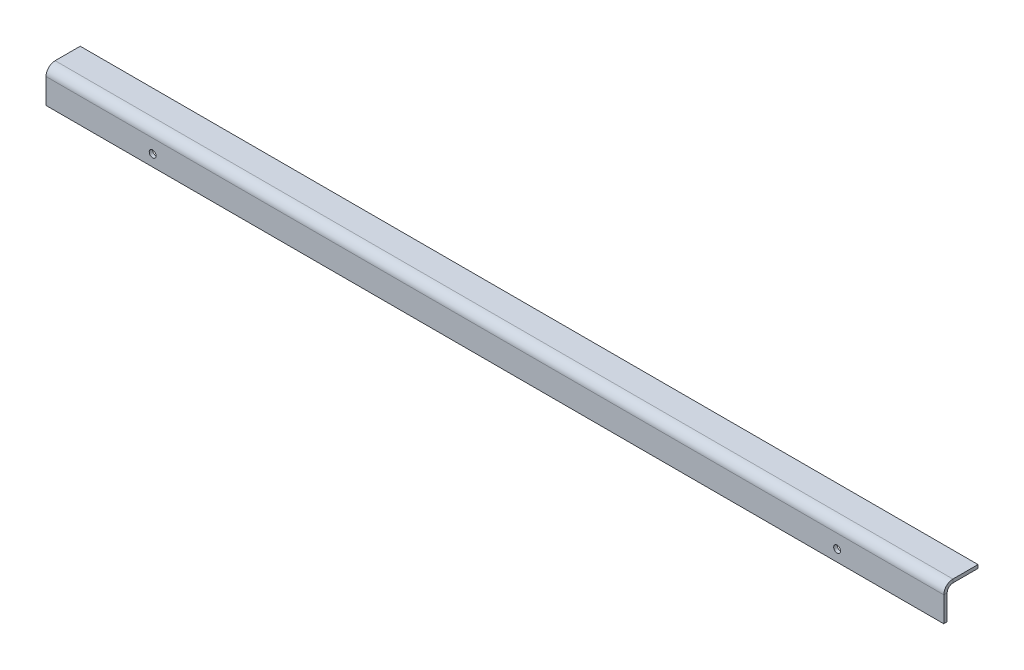
ISO-10303-21;
HEADER;
FILE_DESCRIPTION(('STEP AP214'),'2;1');
FILE_NAME('part.step','',(''),(''),'','','');
FILE_SCHEMA(('AUTOMOTIVE_DESIGN { 1 0 10303 214 1 1 1 1 }'));
ENDSEC;
DATA;
#1=APPLICATION_CONTEXT('core data for automotive mechanical design processes');
#2=APPLICATION_PROTOCOL_DEFINITION('international standard','automotive_design',2000,#1);
#3=PRODUCT_CONTEXT('',#1,'mechanical');
#4=PRODUCT('Part','Part','',(#3));
#5=PRODUCT_RELATED_PRODUCT_CATEGORY('part','',(#4));
#6=PRODUCT_DEFINITION_FORMATION('','',#4);
#7=PRODUCT_DEFINITION_CONTEXT('part definition',#1,'design');
#8=PRODUCT_DEFINITION('design','',#6,#7);
#9=PRODUCT_DEFINITION_SHAPE('','',#8);
#10=(LENGTH_UNIT() NAMED_UNIT(*) SI_UNIT(.MILLI.,.METRE.));
#11=(NAMED_UNIT(*) PLANE_ANGLE_UNIT() SI_UNIT($,.RADIAN.));
#12=(NAMED_UNIT(*) SI_UNIT($,.STERADIAN.) SOLID_ANGLE_UNIT());
#13=UNCERTAINTY_MEASURE_WITH_UNIT(LENGTH_MEASURE(1.E-05),#10,'distance_accuracy_value','');
#14=(GEOMETRIC_REPRESENTATION_CONTEXT(3) GLOBAL_UNCERTAINTY_ASSIGNED_CONTEXT((#13)) GLOBAL_UNIT_ASSIGNED_CONTEXT((#10,
#11,#12)) REPRESENTATION_CONTEXT('',''));
#15=CARTESIAN_POINT('',(0.,0.,0.));
#16=DIRECTION('',(0.,0.,1.));
#17=DIRECTION('',(1.,0.,0.));
#18=AXIS2_PLACEMENT_3D('',#15,#16,#17);
#19=CARTESIAN_POINT('',(393.5,30.,-8.00000000000001));
#20=DIRECTION('',(1.,0.,0.));
#21=DIRECTION('',(0.,0.,-1.));
#22=AXIS2_PLACEMENT_3D('',#19,#20,#21);
#23=PLANE('',#22);
#24=DIRECTION('',(0.,-1.,0.));
#25=VECTOR('',#24,1.);
#26=CARTESIAN_POINT('',(393.5,30.,-8.00000000000001));
#27=LINE('',#26,#25);
#28=CARTESIAN_POINT('',(393.5,30.,-8.00000000000001));
#29=VERTEX_POINT('',#28);
#30=CARTESIAN_POINT('',(393.5,27.,-8.00000000000001));
#31=VERTEX_POINT('',#30);
#32=EDGE_CURVE('E11',#29,#31,#27,.T.);
#33=ORIENTED_EDGE('',*,*,#32,.F.);
#34=CARTESIAN_POINT('',(393.5,22.,-8.00000000000001));
#35=DIRECTION('',(1.,0.,0.));
#36=DIRECTION('',(0.,0.,-1.));
#37=AXIS2_PLACEMENT_3D('',#34,#35,#36);
#38=CIRCLE('',#37,8.);
#39=CARTESIAN_POINT('',(393.5,22.,0.));
#40=VERTEX_POINT('',#39);
#41=EDGE_CURVE('E136',#40,#29,#38,.F.);
#42=ORIENTED_EDGE('',*,*,#41,.F.);
#43=DIRECTION('',(0.,0.,1.));
#44=VECTOR('',#43,1.);
#45=CARTESIAN_POINT('',(393.5,22.,-3.));
#46=LINE('',#45,#44);
#47=CARTESIAN_POINT('',(393.5,22.,-3.));
#48=VERTEX_POINT('',#47);
#49=EDGE_CURVE('E46',#48,#40,#46,.T.);
#50=ORIENTED_EDGE('',*,*,#49,.F.);
#51=CARTESIAN_POINT('',(393.5,22.,-8.00000000000001));
#52=DIRECTION('',(1.,0.,0.));
#53=DIRECTION('',(0.,0.,-1.));
#54=AXIS2_PLACEMENT_3D('',#51,#52,#53);
#55=CIRCLE('',#54,5.);
#56=EDGE_CURVE('E129',#48,#31,#55,.F.);
#57=ORIENTED_EDGE('',*,*,#56,.T.);
#58=EDGE_LOOP('',(#33,#42,#50,#57));
#59=FACE_BOUND('',#58,.T.);
#60=ADVANCED_FACE('F37',(#59),#23,.T.);
#61=CARTESIAN_POINT('',(393.5,22.,-3.));
#62=DIRECTION('',(1.,0.,0.));
#63=DIRECTION('',(0.,0.,-1.));
#64=AXIS2_PLACEMENT_3D('',#61,#62,#63);
#65=PLANE('',#64);
#66=DIRECTION('',(0.,0.,-1.));
#67=VECTOR('',#66,1.);
#68=CARTESIAN_POINT('',(393.5,30.,0.));
#69=LINE('',#68,#67);
#70=CARTESIAN_POINT('',(393.5,30.,-29.9999999999999));
#71=VERTEX_POINT('',#70);
#72=EDGE_CURVE('E193',#29,#71,#69,.T.);
#73=ORIENTED_EDGE('',*,*,#72,.F.);
#74=ORIENTED_EDGE('',*,*,#32,.T.);
#75=DIRECTION('',(0.,0.,-1.));
#76=VECTOR('',#75,1.);
#77=CARTESIAN_POINT('',(393.5,27.,0.));
#78=LINE('',#77,#76);
#79=CARTESIAN_POINT('',(393.5,27.,-29.9999999999999));
#80=VERTEX_POINT('',#79);
#81=EDGE_CURVE('E95',#31,#80,#78,.T.);
#82=ORIENTED_EDGE('',*,*,#81,.T.);
#83=DIRECTION('',(0.,-1.,0.));
#84=VECTOR('',#83,1.);
#85=CARTESIAN_POINT('',(393.5,30.,-29.9999999999999));
#86=LINE('',#85,#84);
#87=EDGE_CURVE('E190',#71,#80,#86,.T.);
#88=ORIENTED_EDGE('',*,*,#87,.F.);
#89=EDGE_LOOP('',(#73,#74,#82,#88));
#90=FACE_BOUND('',#89,.T.);
#91=ADVANCED_FACE('F213',(#90),#65,.T.);
#92=CARTESIAN_POINT('',(-393.5,22.,0.));
#93=DIRECTION('',(-1.,0.,0.));
#94=DIRECTION('',(0.,0.,1.));
#95=AXIS2_PLACEMENT_3D('',#92,#93,#94);
#96=PLANE('',#95);
#97=DIRECTION('',(0.,0.,-1.));
#98=VECTOR('',#97,1.);
#99=CARTESIAN_POINT('',(-393.5,22.,0.));
#100=LINE('',#99,#98);
#101=CARTESIAN_POINT('',(-393.5,22.,0.));
#102=VERTEX_POINT('',#101);
#103=CARTESIAN_POINT('',(-393.5,22.,-3.));
#104=VERTEX_POINT('',#103);
#105=EDGE_CURVE('E82',#102,#104,#100,.T.);
#106=ORIENTED_EDGE('',*,*,#105,.F.);
#107=CARTESIAN_POINT('',(-393.5,22.,-8.00000000000001));
#108=DIRECTION('',(1.,0.,0.));
#109=DIRECTION('',(0.,0.,-1.));
#110=AXIS2_PLACEMENT_3D('',#107,#108,#109);
#111=CIRCLE('',#110,8.);
#112=CARTESIAN_POINT('',(-393.5,30.,-8.00000000000001));
#113=VERTEX_POINT('',#112);
#114=EDGE_CURVE('E152',#102,#113,#111,.F.);
#115=ORIENTED_EDGE('',*,*,#114,.T.);
#116=DIRECTION('',(0.,1.,0.));
#117=VECTOR('',#116,1.);
#118=CARTESIAN_POINT('',(-393.5,27.,-8.00000000000001));
#119=LINE('',#118,#117);
#120=CARTESIAN_POINT('',(-393.5,27.,-8.00000000000001));
#121=VERTEX_POINT('',#120);
#122=EDGE_CURVE('E89',#121,#113,#119,.T.);
#123=ORIENTED_EDGE('',*,*,#122,.F.);
#124=CARTESIAN_POINT('',(-393.5,22.,-8.00000000000001));
#125=DIRECTION('',(1.,0.,0.));
#126=DIRECTION('',(0.,0.,-1.));
#127=AXIS2_PLACEMENT_3D('',#124,#125,#126);
#128=CIRCLE('',#127,5.);
#129=EDGE_CURVE('E159',#104,#121,#128,.F.);
#130=ORIENTED_EDGE('',*,*,#129,.F.);
#131=EDGE_LOOP('',(#106,#115,#123,#130));
#132=FACE_BOUND('',#131,.T.);
#133=ADVANCED_FACE('F211',(#132),#96,.T.);
#134=CARTESIAN_POINT('',(-393.5,27.,-8.00000000000001));
#135=DIRECTION('',(-1.,0.,0.));
#136=DIRECTION('',(0.,0.,1.));
#137=AXIS2_PLACEMENT_3D('',#134,#135,#136);
#138=PLANE('',#137);
#139=DIRECTION('',(0.,1.,0.));
#140=VECTOR('',#139,1.);
#141=CARTESIAN_POINT('',(-393.5,0.,0.));
#142=LINE('',#141,#140);
#143=CARTESIAN_POINT('',(-393.5,0.,0.));
#144=VERTEX_POINT('',#143);
#145=EDGE_CURVE('E154',#144,#102,#142,.T.);
#146=ORIENTED_EDGE('',*,*,#145,.T.);
#147=ORIENTED_EDGE('',*,*,#105,.T.);
#148=DIRECTION('',(0.,1.,0.));
#149=VECTOR('',#148,1.);
#150=CARTESIAN_POINT('',(-393.5,0.,-3.));
#151=LINE('',#150,#149);
#152=CARTESIAN_POINT('',(-393.5,0.,-3.));
#153=VERTEX_POINT('',#152);
#154=EDGE_CURVE('E157',#153,#104,#151,.T.);
#155=ORIENTED_EDGE('',*,*,#154,.F.);
#156=DIRECTION('',(0.,0.,1.));
#157=VECTOR('',#156,1.);
#158=CARTESIAN_POINT('',(-393.5,0.,-3.));
#159=LINE('',#158,#157);
#160=EDGE_CURVE('E117',#153,#144,#159,.T.);
#161=ORIENTED_EDGE('',*,*,#160,.T.);
#162=EDGE_LOOP('',(#146,#147,#155,#161));
#163=FACE_BOUND('',#162,.T.);
#164=ADVANCED_FACE('F207',(#163),#138,.T.);
#165=CARTESIAN_POINT('',(393.5,27.,0.));
#166=DIRECTION('',(0.,1.,0.));
#167=DIRECTION('',(0.,0.,1.));
#168=AXIS2_PLACEMENT_3D('',#165,#166,#167);
#169=PLANE('',#168);
#170=DIRECTION('',(0.,0.,-1.));
#171=VECTOR('',#170,1.);
#172=CARTESIAN_POINT('',(-393.5,27.,0.));
#173=LINE('',#172,#171);
#174=CARTESIAN_POINT('',(-393.5,27.,-30.));
#175=VERTEX_POINT('',#174);
#176=EDGE_CURVE('E142',#121,#175,#173,.T.);
#177=ORIENTED_EDGE('',*,*,#176,.T.);
#178=DIRECTION('',(-1.,0.,0.));
#179=VECTOR('',#178,1.);
#180=CARTESIAN_POINT('',(393.5,27.,-29.9999999999999));
#181=LINE('',#180,#179);
#182=EDGE_CURVE('E173',#80,#175,#181,.T.);
#183=ORIENTED_EDGE('',*,*,#182,.F.);
#184=ORIENTED_EDGE('',*,*,#81,.F.);
#185=DIRECTION('',(-1.,0.,0.));
#186=VECTOR('',#185,1.);
#187=CARTESIAN_POINT('',(393.5,27.,-8.00000000000001));
#188=LINE('',#187,#186);
#189=EDGE_CURVE('E141',#31,#121,#188,.T.);
#190=ORIENTED_EDGE('',*,*,#189,.T.);
#191=EDGE_LOOP('',(#177,#183,#184,#190));
#192=FACE_BOUND('',#191,.T.);
#193=ADVANCED_FACE('F219',(#192),#169,.F.);
#194=CARTESIAN_POINT('',(393.5,30.,-29.9999999999999));
#195=DIRECTION('',(0.,0.,-1.));
#196=DIRECTION('',(-1.,0.,0.));
#197=AXIS2_PLACEMENT_3D('',#194,#195,#196);
#198=PLANE('',#197);
#199=DIRECTION('',(0.,-1.,0.));
#200=VECTOR('',#199,1.);
#201=CARTESIAN_POINT('',(-393.5,30.,-30.));
#202=LINE('',#201,#200);
#203=CARTESIAN_POINT('',(-393.5,30.,-30.));
#204=VERTEX_POINT('',#203);
#205=EDGE_CURVE('E145',#204,#175,#202,.T.);
#206=ORIENTED_EDGE('',*,*,#205,.F.);
#207=DIRECTION('',(-1.,0.,0.));
#208=VECTOR('',#207,1.);
#209=CARTESIAN_POINT('',(393.5,30.,-29.9999999999999));
#210=LINE('',#209,#208);
#211=EDGE_CURVE('E171',#71,#204,#210,.T.);
#212=ORIENTED_EDGE('',*,*,#211,.F.);
#213=ORIENTED_EDGE('',*,*,#87,.T.);
#214=ORIENTED_EDGE('',*,*,#182,.T.);
#215=EDGE_LOOP('',(#206,#212,#213,#214));
#216=FACE_BOUND('',#215,.T.);
#217=ADVANCED_FACE('F250',(#216),#198,.T.);
#218=CARTESIAN_POINT('',(393.5,30.,0.));
#219=DIRECTION('',(0.,1.,0.));
#220=DIRECTION('',(0.,0.,1.));
#221=AXIS2_PLACEMENT_3D('',#218,#219,#220);
#222=PLANE('',#221);
#223=DIRECTION('',(0.,0.,-1.));
#224=VECTOR('',#223,1.);
#225=CARTESIAN_POINT('',(-393.5,30.,0.));
#226=LINE('',#225,#224);
#227=EDGE_CURVE('E149',#113,#204,#226,.T.);
#228=ORIENTED_EDGE('',*,*,#227,.F.);
#229=DIRECTION('',(-1.,0.,0.));
#230=VECTOR('',#229,1.);
#231=CARTESIAN_POINT('',(393.5,30.,-8.00000000000001));
#232=LINE('',#231,#230);
#233=EDGE_CURVE('E168',#29,#113,#232,.T.);
#234=ORIENTED_EDGE('',*,*,#233,.F.);
#235=ORIENTED_EDGE('',*,*,#72,.T.);
#236=ORIENTED_EDGE('',*,*,#211,.T.);
#237=EDGE_LOOP('',(#228,#234,#235,#236));
#238=FACE_BOUND('',#237,.T.);
#239=ADVANCED_FACE('F261',(#238),#222,.T.);
#240=CARTESIAN_POINT('',(393.5,22.,-8.00000000000001));
#241=DIRECTION('',(-1.,0.,0.));
#242=DIRECTION('',(0.,0.,1.));
#243=AXIS2_PLACEMENT_3D('',#240,#241,#242);
#244=CYLINDRICAL_SURFACE('',#243,8.);
#245=ORIENTED_EDGE('',*,*,#114,.F.);
#246=DIRECTION('',(-1.,0.,0.));
#247=VECTOR('',#246,1.);
#248=CARTESIAN_POINT('',(393.5,22.,0.));
#249=LINE('',#248,#247);
#250=EDGE_CURVE('E165',#40,#102,#249,.T.);
#251=ORIENTED_EDGE('',*,*,#250,.F.);
#252=ORIENTED_EDGE('',*,*,#41,.T.);
#253=ORIENTED_EDGE('',*,*,#233,.T.);
#254=EDGE_LOOP('',(#245,#251,#252,#253));
#255=FACE_BOUND('',#254,.T.);
#256=ADVANCED_FACE('F200',(#255),#244,.T.);
#257=CARTESIAN_POINT('',(393.5,0.,0.));
#258=DIRECTION('',(0.,0.,1.));
#259=DIRECTION('',(1.,0.,0.));
#260=AXIS2_PLACEMENT_3D('',#257,#258,#259);
#261=PLANE('',#260);
#262=CARTESIAN_POINT('',(-300.,10.0000000000001,0.));
#263=DIRECTION('',(0.,0.,1.));
#264=DIRECTION('',(1.,0.,0.));
#265=AXIS2_PLACEMENT_3D('',#262,#263,#264);
#266=CIRCLE('',#265,2.99999999999999);
#267=CARTESIAN_POINT('',(-297.,10.0000000000001,0.));
#268=VERTEX_POINT('',#267);
#269=EDGE_CURVE('E186',#268,#268,#266,.T.);
#270=ORIENTED_EDGE('',*,*,#269,.F.);
#271=EDGE_LOOP('',(#270));
#272=FACE_BOUND('',#271,.T.);
#273=CARTESIAN_POINT('',(300.,10.0000000000001,0.));
#274=DIRECTION('',(0.,0.,1.));
#275=DIRECTION('',(1.,0.,0.));
#276=AXIS2_PLACEMENT_3D('',#273,#274,#275);
#277=CIRCLE('',#276,2.99999999999999);
#278=CARTESIAN_POINT('',(303.,10.0000000000001,0.));
#279=VERTEX_POINT('',#278);
#280=EDGE_CURVE('E178',#279,#279,#277,.T.);
#281=ORIENTED_EDGE('',*,*,#280,.F.);
#282=EDGE_LOOP('',(#281));
#283=FACE_BOUND('',#282,.T.);
#284=ORIENTED_EDGE('',*,*,#145,.F.);
#285=DIRECTION('',(-1.,0.,0.));
#286=VECTOR('',#285,1.);
#287=CARTESIAN_POINT('',(393.5,0.,0.));
#288=LINE('',#287,#286);
#289=CARTESIAN_POINT('',(393.5,0.,0.));
#290=VERTEX_POINT('',#289);
#291=EDGE_CURVE('E119',#290,#144,#288,.T.);
#292=ORIENTED_EDGE('',*,*,#291,.F.);
#293=DIRECTION('',(0.,1.,0.));
#294=VECTOR('',#293,1.);
#295=CARTESIAN_POINT('',(393.5,0.,0.));
#296=LINE('',#295,#294);
#297=EDGE_CURVE('E134',#290,#40,#296,.T.);
#298=ORIENTED_EDGE('',*,*,#297,.T.);
#299=ORIENTED_EDGE('',*,*,#250,.T.);
#300=EDGE_LOOP('',(#284,#292,#298,#299));
#301=FACE_BOUND('',#300,.T.);
#302=ADVANCED_FACE('F206',(#272,#283,#301),#261,.T.);
#303=CARTESIAN_POINT('',(393.5,0.,-3.));
#304=DIRECTION('',(0.,-1.,0.));
#305=DIRECTION('',(0.,0.,-1.));
#306=AXIS2_PLACEMENT_3D('',#303,#304,#305);
#307=PLANE('',#306);
#308=ORIENTED_EDGE('',*,*,#160,.F.);
#309=DIRECTION('',(-1.,0.,0.));
#310=VECTOR('',#309,1.);
#311=CARTESIAN_POINT('',(393.5,0.,-3.));
#312=LINE('',#311,#310);
#313=CARTESIAN_POINT('',(393.5,0.,-3.));
#314=VERTEX_POINT('',#313);
#315=EDGE_CURVE('E111',#314,#153,#312,.T.);
#316=ORIENTED_EDGE('',*,*,#315,.F.);
#317=DIRECTION('',(0.,0.,1.));
#318=VECTOR('',#317,1.);
#319=CARTESIAN_POINT('',(393.5,0.,-3.));
#320=LINE('',#319,#318);
#321=EDGE_CURVE('E115',#314,#290,#320,.T.);
#322=ORIENTED_EDGE('',*,*,#321,.T.);
#323=ORIENTED_EDGE('',*,*,#291,.T.);
#324=EDGE_LOOP('',(#308,#316,#322,#323));
#325=FACE_BOUND('',#324,.T.);
#326=ADVANCED_FACE('F113',(#325),#307,.T.);
#327=CARTESIAN_POINT('',(393.5,0.,-3.));
#328=DIRECTION('',(0.,0.,1.));
#329=DIRECTION('',(1.,0.,0.));
#330=AXIS2_PLACEMENT_3D('',#327,#328,#329);
#331=PLANE('',#330);
#332=CARTESIAN_POINT('',(-300.,10.0000000000001,-3.));
#333=DIRECTION('',(0.,0.,1.));
#334=DIRECTION('',(1.,0.,0.));
#335=AXIS2_PLACEMENT_3D('',#332,#333,#334);
#336=CIRCLE('',#335,2.99999999999999);
#337=CARTESIAN_POINT('',(-297.,10.0000000000001,-3.));
#338=VERTEX_POINT('',#337);
#339=EDGE_CURVE('E40',#338,#338,#336,.T.);
#340=ORIENTED_EDGE('',*,*,#339,.T.);
#341=EDGE_LOOP('',(#340));
#342=FACE_BOUND('',#341,.T.);
#343=CARTESIAN_POINT('',(300.,10.0000000000001,-3.));
#344=DIRECTION('',(0.,0.,1.));
#345=DIRECTION('',(1.,0.,0.));
#346=AXIS2_PLACEMENT_3D('',#343,#344,#345);
#347=CIRCLE('',#346,2.99999999999999);
#348=CARTESIAN_POINT('',(303.,10.0000000000001,-3.));
#349=VERTEX_POINT('',#348);
#350=EDGE_CURVE('E146',#349,#349,#347,.T.);
#351=ORIENTED_EDGE('',*,*,#350,.T.);
#352=EDGE_LOOP('',(#351));
#353=FACE_BOUND('',#352,.T.);
#354=ORIENTED_EDGE('',*,*,#154,.T.);
#355=DIRECTION('',(-1.,0.,0.));
#356=VECTOR('',#355,1.);
#357=CARTESIAN_POINT('',(393.5,22.,-3.));
#358=LINE('',#357,#356);
#359=EDGE_CURVE('E120',#48,#104,#358,.T.);
#360=ORIENTED_EDGE('',*,*,#359,.F.);
#361=DIRECTION('',(0.,1.,0.));
#362=VECTOR('',#361,1.);
#363=CARTESIAN_POINT('',(393.5,0.,-3.));
#364=LINE('',#363,#362);
#365=EDGE_CURVE('E124',#314,#48,#364,.T.);
#366=ORIENTED_EDGE('',*,*,#365,.F.);
#367=ORIENTED_EDGE('',*,*,#315,.T.);
#368=EDGE_LOOP('',(#354,#360,#366,#367));
#369=FACE_BOUND('',#368,.T.);
#370=ADVANCED_FACE('F125',(#342,#353,#369),#331,.F.);
#371=CARTESIAN_POINT('',(393.5,22.,-8.00000000000001));
#372=DIRECTION('',(-1.,0.,0.));
#373=DIRECTION('',(0.,0.,1.));
#374=AXIS2_PLACEMENT_3D('',#371,#372,#373);
#375=CYLINDRICAL_SURFACE('',#374,5.);
#376=ORIENTED_EDGE('',*,*,#129,.T.);
#377=ORIENTED_EDGE('',*,*,#189,.F.);
#378=ORIENTED_EDGE('',*,*,#56,.F.);
#379=ORIENTED_EDGE('',*,*,#359,.T.);
#380=EDGE_LOOP('',(#376,#377,#378,#379));
#381=FACE_BOUND('',#380,.T.);
#382=ADVANCED_FACE('F209',(#381),#375,.F.);
#383=CARTESIAN_POINT('',(393.5,22.,-8.00000000000001));
#384=DIRECTION('',(1.,0.,0.));
#385=DIRECTION('',(0.,0.,-1.));
#386=AXIS2_PLACEMENT_3D('',#383,#384,#385);
#387=PLANE('',#386);
#388=ORIENTED_EDGE('',*,*,#365,.T.);
#389=ORIENTED_EDGE('',*,*,#49,.T.);
#390=ORIENTED_EDGE('',*,*,#297,.F.);
#391=ORIENTED_EDGE('',*,*,#321,.F.);
#392=EDGE_LOOP('',(#388,#389,#390,#391));
#393=FACE_BOUND('',#392,.T.);
#394=ADVANCED_FACE('F132',(#393),#387,.T.);
#395=CARTESIAN_POINT('',(-393.5,22.,-8.00000000000001));
#396=DIRECTION('',(1.,0.,0.));
#397=DIRECTION('',(0.,0.,-1.));
#398=AXIS2_PLACEMENT_3D('',#395,#396,#397);
#399=PLANE('',#398);
#400=ORIENTED_EDGE('',*,*,#176,.F.);
#401=ORIENTED_EDGE('',*,*,#122,.T.);
#402=ORIENTED_EDGE('',*,*,#227,.T.);
#403=ORIENTED_EDGE('',*,*,#205,.T.);
#404=EDGE_LOOP('',(#400,#401,#402,#403));
#405=FACE_BOUND('',#404,.T.);
#406=ADVANCED_FACE('F329',(#405),#399,.F.);
#407=CARTESIAN_POINT('',(300.,10.0000000000001,-30.));
#408=DIRECTION('',(0.,0.,1.));
#409=DIRECTION('',(1.,0.,0.));
#410=AXIS2_PLACEMENT_3D('',#407,#408,#409);
#411=CYLINDRICAL_SURFACE('',#410,2.99999999999999);
#412=ORIENTED_EDGE('',*,*,#280,.T.);
#413=EDGE_LOOP('',(#412));
#414=FACE_BOUND('',#413,.T.);
#415=ORIENTED_EDGE('',*,*,#350,.F.);
#416=EDGE_LOOP('',(#415));
#417=FACE_BOUND('',#416,.T.);
#418=ADVANCED_FACE('F339',(#414,#417),#411,.F.);
#419=CARTESIAN_POINT('',(-300.,10.0000000000001,-29.9999999999999));
#420=DIRECTION('',(0.,0.,1.));
#421=DIRECTION('',(1.,0.,0.));
#422=AXIS2_PLACEMENT_3D('',#419,#420,#421);
#423=CYLINDRICAL_SURFACE('',#422,2.99999999999999);
#424=ORIENTED_EDGE('',*,*,#269,.T.);
#425=EDGE_LOOP('',(#424));
#426=FACE_BOUND('',#425,.T.);
#427=ORIENTED_EDGE('',*,*,#339,.F.);
#428=EDGE_LOOP('',(#427));
#429=FACE_BOUND('',#428,.T.);
#430=ADVANCED_FACE('F350',(#426,#429),#423,.F.);
#431=CLOSED_SHELL('',(#60,#91,#133,#164,#193,#217,#239,#256,#302,#326,#370,#382,#394,#406,#418,#430));
#432=MANIFOLD_SOLID_BREP('B2',#431);
#433=ADVANCED_BREP_SHAPE_REPRESENTATION('',(#18,#432),#14);
#434=SHAPE_DEFINITION_REPRESENTATION(#9,#433);
ENDSEC;
END-ISO-10303-21;
